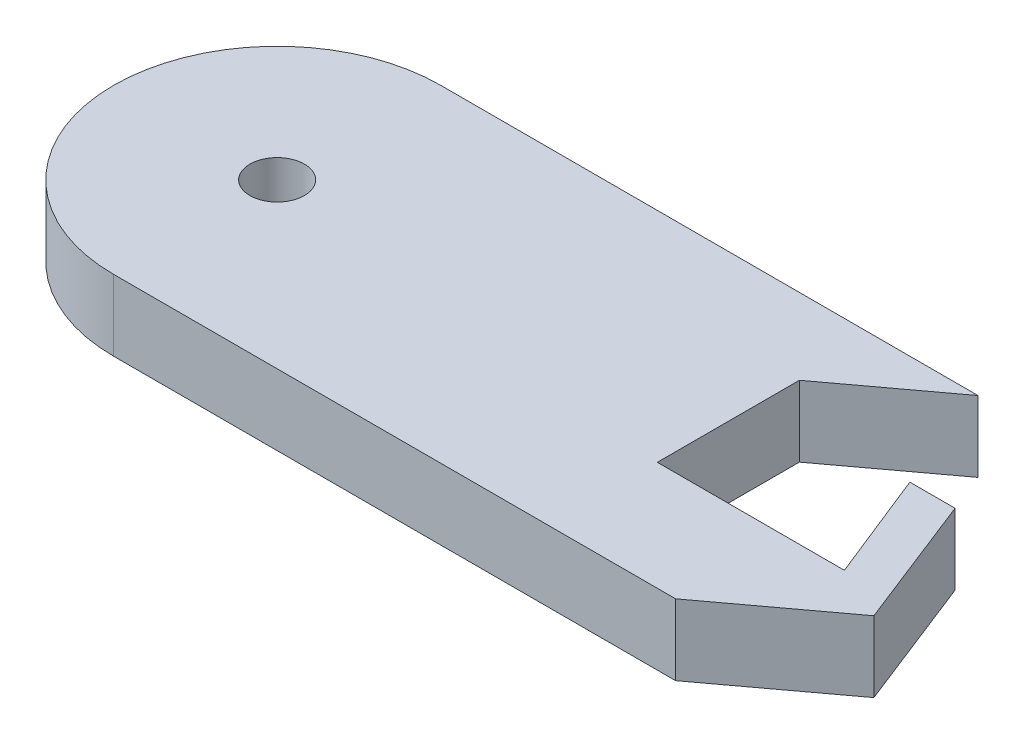
ISO-10303-21;
HEADER;
FILE_DESCRIPTION(('STEP AP214'),'2;1');
FILE_NAME('part.step','',(''),(''),'','','');
FILE_SCHEMA(('AUTOMOTIVE_DESIGN { 1 0 10303 214 1 1 1 1 }'));
ENDSEC;
DATA;
#1=APPLICATION_CONTEXT('core data for automotive mechanical design processes');
#2=APPLICATION_PROTOCOL_DEFINITION('international standard','automotive_design',2000,#1);
#3=PRODUCT_CONTEXT('',#1,'mechanical');
#4=PRODUCT('Part','Part','',(#3));
#5=PRODUCT_RELATED_PRODUCT_CATEGORY('part','',(#4));
#6=PRODUCT_DEFINITION_FORMATION('','',#4);
#7=PRODUCT_DEFINITION_CONTEXT('part definition',#1,'design');
#8=PRODUCT_DEFINITION('design','',#6,#7);
#9=PRODUCT_DEFINITION_SHAPE('','',#8);
#10=(LENGTH_UNIT() NAMED_UNIT(*) SI_UNIT(.MILLI.,.METRE.));
#11=(NAMED_UNIT(*) PLANE_ANGLE_UNIT() SI_UNIT($,.RADIAN.));
#12=(NAMED_UNIT(*) SI_UNIT($,.STERADIAN.) SOLID_ANGLE_UNIT());
#13=UNCERTAINTY_MEASURE_WITH_UNIT(LENGTH_MEASURE(1.E-05),#10,'distance_accuracy_value','');
#14=(GEOMETRIC_REPRESENTATION_CONTEXT(3) GLOBAL_UNCERTAINTY_ASSIGNED_CONTEXT((#13)) GLOBAL_UNIT_ASSIGNED_CONTEXT((#10,
#11,#12)) REPRESENTATION_CONTEXT('',''));
#15=CARTESIAN_POINT('',(0.,0.,0.));
#16=DIRECTION('',(0.,0.,1.));
#17=DIRECTION('',(1.,0.,0.));
#18=AXIS2_PLACEMENT_3D('',#15,#16,#17);
#19=CARTESIAN_POINT('',(0.,6.5,0.));
#20=DIRECTION('',(0.,0.,-1.));
#21=DIRECTION('',(-1.,0.,0.));
#22=AXIS2_PLACEMENT_3D('',#19,#20,#21);
#23=PLANE('',#22);
#24=DIRECTION('',(1.,0.,0.));
#25=VECTOR('',#24,1.);
#26=CARTESIAN_POINT('',(0.,0.,0.));
#27=LINE('',#26,#25);
#28=CARTESIAN_POINT('',(15.,0.,0.));
#29=VERTEX_POINT('',#28);
#30=CARTESIAN_POINT('',(66.5254035020398,0.,0.));
#31=VERTEX_POINT('',#30);
#32=EDGE_CURVE('E127',#29,#31,#27,.T.);
#33=ORIENTED_EDGE('',*,*,#32,.T.);
#34=DIRECTION('',(0.,1.,0.));
#35=VECTOR('',#34,1.);
#36=CARTESIAN_POINT('',(66.5254035020398,0.,0.));
#37=LINE('',#36,#35);
#38=CARTESIAN_POINT('',(66.5254035020398,6.5,0.));
#39=VERTEX_POINT('',#38);
#40=EDGE_CURVE('E113',#31,#39,#37,.T.);
#41=ORIENTED_EDGE('',*,*,#40,.T.);
#42=DIRECTION('',(1.,0.,0.));
#43=VECTOR('',#42,1.);
#44=CARTESIAN_POINT('',(0.,6.5,0.));
#45=LINE('',#44,#43);
#46=CARTESIAN_POINT('',(15.,6.5,0.));
#47=VERTEX_POINT('',#46);
#48=EDGE_CURVE('E136',#47,#39,#45,.T.);
#49=ORIENTED_EDGE('',*,*,#48,.F.);
#50=DIRECTION('',(0.,-1.,0.));
#51=VECTOR('',#50,1.);
#52=CARTESIAN_POINT('',(15.,6.5,0.));
#53=LINE('',#52,#51);
#54=EDGE_CURVE('E132',#47,#29,#53,.T.);
#55=ORIENTED_EDGE('',*,*,#54,.T.);
#56=EDGE_LOOP('',(#33,#41,#49,#55));
#57=FACE_BOUND('',#56,.T.);
#58=ADVANCED_FACE('F33',(#57),#23,.F.);
#59=CARTESIAN_POINT('',(0.,6.5,-30.));
#60=DIRECTION('',(0.,0.,1.));
#61=DIRECTION('',(1.,0.,0.));
#62=AXIS2_PLACEMENT_3D('',#59,#60,#61);
#63=PLANE('',#62);
#64=DIRECTION('',(-1.,0.,0.));
#65=VECTOR('',#64,1.);
#66=CARTESIAN_POINT('',(0.,6.5,-30.));
#67=LINE('',#66,#65);
#68=CARTESIAN_POINT('',(64.2482131812013,6.5,-30.));
#69=VERTEX_POINT('',#68);
#70=CARTESIAN_POINT('',(15.,6.5,-30.));
#71=VERTEX_POINT('',#70);
#72=EDGE_CURVE('E141',#69,#71,#67,.T.);
#73=ORIENTED_EDGE('',*,*,#72,.F.);
#74=DIRECTION('',(0.,1.,0.));
#75=VECTOR('',#74,1.);
#76=CARTESIAN_POINT('',(64.2482131812013,0.,-30.));
#77=LINE('',#76,#75);
#78=CARTESIAN_POINT('',(64.2482131812013,0.,-30.));
#79=VERTEX_POINT('',#78);
#80=EDGE_CURVE('E179',#79,#69,#77,.T.);
#81=ORIENTED_EDGE('',*,*,#80,.F.);
#82=DIRECTION('',(-1.,0.,0.));
#83=VECTOR('',#82,1.);
#84=CARTESIAN_POINT('',(0.,0.,-30.));
#85=LINE('',#84,#83);
#86=CARTESIAN_POINT('',(15.,0.,-30.));
#87=VERTEX_POINT('',#86);
#88=EDGE_CURVE('E133',#79,#87,#85,.T.);
#89=ORIENTED_EDGE('',*,*,#88,.T.);
#90=DIRECTION('',(0.,-1.,0.));
#91=VECTOR('',#90,1.);
#92=CARTESIAN_POINT('',(15.,6.5,-30.));
#93=LINE('',#92,#91);
#94=EDGE_CURVE('E41',#87,#71,#93,.F.);
#95=ORIENTED_EDGE('',*,*,#94,.T.);
#96=EDGE_LOOP('',(#73,#81,#89,#95));
#97=FACE_BOUND('',#96,.T.);
#98=ADVANCED_FACE('F159',(#97),#63,.F.);
#99=CARTESIAN_POINT('',(0.,6.5,0.));
#100=DIRECTION('',(0.,-1.,0.));
#101=DIRECTION('',(0.,0.,-1.));
#102=AXIS2_PLACEMENT_3D('',#99,#100,#101);
#103=PLANE('',#102);
#104=CARTESIAN_POINT('',(15.,6.5,-15.));
#105=DIRECTION('',(0.,1.,0.));
#106=DIRECTION('',(0.,0.,1.));
#107=AXIS2_PLACEMENT_3D('',#104,#105,#106);
#108=CIRCLE('',#107,2.5);
#109=CARTESIAN_POINT('',(15.,6.5,-12.5));
#110=VERTEX_POINT('',#109);
#111=EDGE_CURVE('E139',#110,#110,#108,.T.);
#112=ORIENTED_EDGE('',*,*,#111,.F.);
#113=EDGE_LOOP('',(#112));
#114=FACE_BOUND('',#113,.T.);
#115=ORIENTED_EDGE('',*,*,#48,.T.);
#116=DIRECTION('',(-0.803020489652228,0.,0.595951418488702));
#117=VECTOR('',#116,1.);
#118=CARTESIAN_POINT('',(80.,6.5,-10.));
#119=LINE('',#118,#117);
#120=CARTESIAN_POINT('',(76.9595603796193,6.5,-7.74357649905065));
#121=VERTEX_POINT('',#120);
#122=EDGE_CURVE('E116',#121,#39,#119,.T.);
#123=ORIENTED_EDGE('',*,*,#122,.F.);
#124=DIRECTION('',(0.36547745050438,0.,0.930820193792989));
#125=VECTOR('',#124,1.);
#126=CARTESIAN_POINT('',(80.,6.5,0.));
#127=LINE('',#126,#125);
#128=CARTESIAN_POINT('',(72.1471954961549,6.5,-20.));
#129=VERTEX_POINT('',#128);
#130=EDGE_CURVE('E121',#129,#121,#127,.T.);
#131=ORIENTED_EDGE('',*,*,#130,.F.);
#132=DIRECTION('',(1.,0.,0.));
#133=VECTOR('',#132,1.);
#134=CARTESIAN_POINT('',(68.,6.5,-20.));
#135=LINE('',#134,#133);
#136=CARTESIAN_POINT('',(68.,6.5,-20.));
#137=VERTEX_POINT('',#136);
#138=EDGE_CURVE('E200',#137,#129,#135,.T.);
#139=ORIENTED_EDGE('',*,*,#138,.F.);
#140=DIRECTION('',(-0.371390676354104,0.,-0.928476690885259));
#141=VECTOR('',#140,1.);
#142=CARTESIAN_POINT('',(68.,6.5,-20.));
#143=LINE('',#142,#141);
#144=CARTESIAN_POINT('',(72.,6.5,-10.));
#145=VERTEX_POINT('',#144);
#146=EDGE_CURVE('E189',#145,#137,#143,.T.);
#147=ORIENTED_EDGE('',*,*,#146,.F.);
#148=DIRECTION('',(1.,0.,0.));
#149=VECTOR('',#148,1.);
#150=CARTESIAN_POINT('',(72.,6.5,-10.));
#151=LINE('',#150,#149);
#152=CARTESIAN_POINT('',(54.8504076556922,6.5,-10.));
#153=VERTEX_POINT('',#152);
#154=EDGE_CURVE('E193',#153,#145,#151,.T.);
#155=ORIENTED_EDGE('',*,*,#154,.F.);
#156=DIRECTION('',(0.,0.,1.));
#157=VECTOR('',#156,1.);
#158=CARTESIAN_POINT('',(54.8504076556922,6.5,-10.));
#159=LINE('',#158,#157);
#160=CARTESIAN_POINT('',(54.8504076556922,6.5,-23.0255384441889));
#161=VERTEX_POINT('',#160);
#162=EDGE_CURVE('E196',#161,#153,#159,.T.);
#163=ORIENTED_EDGE('',*,*,#162,.F.);
#164=DIRECTION('',(-0.803020489652228,0.,0.595951418488701));
#165=VECTOR('',#164,1.);
#166=CARTESIAN_POINT('',(54.8504076556922,6.5,-23.0255384441889));
#167=LINE('',#166,#165);
#168=EDGE_CURVE('E171',#69,#161,#167,.T.);
#169=ORIENTED_EDGE('',*,*,#168,.F.);
#170=ORIENTED_EDGE('',*,*,#72,.T.);
#171=CARTESIAN_POINT('',(15.,6.5,-15.));
#172=DIRECTION('',(0.,-1.,0.));
#173=DIRECTION('',(0.,0.,-1.));
#174=AXIS2_PLACEMENT_3D('',#171,#172,#173);
#175=CIRCLE('',#174,15.);
#176=CARTESIAN_POINT('',(0.,6.5,-15.));
#177=VERTEX_POINT('',#176);
#178=EDGE_CURVE('E150',#71,#177,#175,.F.);
#179=ORIENTED_EDGE('',*,*,#178,.T.);
#180=CARTESIAN_POINT('',(15.,6.5,-15.));
#181=DIRECTION('',(0.,-1.,0.));
#182=DIRECTION('',(0.,0.,-1.));
#183=AXIS2_PLACEMENT_3D('',#180,#181,#182);
#184=CIRCLE('',#183,15.);
#185=EDGE_CURVE('E152',#177,#47,#184,.F.);
#186=ORIENTED_EDGE('',*,*,#185,.T.);
#187=EDGE_LOOP('',(#115,#123,#131,#139,#147,#155,#163,#169,#170,#179,#186));
#188=FACE_BOUND('',#187,.T.);
#189=ADVANCED_FACE('F167',(#114,#188),#103,.F.);
#190=CARTESIAN_POINT('',(0.,0.,0.));
#191=DIRECTION('',(0.,-1.,0.));
#192=DIRECTION('',(0.,0.,-1.));
#193=AXIS2_PLACEMENT_3D('',#190,#191,#192);
#194=PLANE('',#193);
#195=DIRECTION('',(-0.803020489652228,0.,0.595951418488702));
#196=VECTOR('',#195,1.);
#197=CARTESIAN_POINT('',(80.,0.,-10.));
#198=LINE('',#197,#196);
#199=CARTESIAN_POINT('',(76.9595603796193,0.,-7.74357649905065));
#200=VERTEX_POINT('',#199);
#201=EDGE_CURVE('E48',#200,#31,#198,.T.);
#202=ORIENTED_EDGE('',*,*,#201,.T.);
#203=ORIENTED_EDGE('',*,*,#32,.F.);
#204=CARTESIAN_POINT('',(15.,0.,-15.));
#205=DIRECTION('',(0.,-1.,0.));
#206=DIRECTION('',(0.,0.,-1.));
#207=AXIS2_PLACEMENT_3D('',#204,#205,#206);
#208=CIRCLE('',#207,15.);
#209=CARTESIAN_POINT('',(0.,0.,-15.));
#210=VERTEX_POINT('',#209);
#211=EDGE_CURVE('E148',#29,#210,#208,.T.);
#212=ORIENTED_EDGE('',*,*,#211,.T.);
#213=CARTESIAN_POINT('',(15.,0.,-15.));
#214=DIRECTION('',(0.,-1.,0.));
#215=DIRECTION('',(0.,0.,-1.));
#216=AXIS2_PLACEMENT_3D('',#213,#214,#215);
#217=CIRCLE('',#216,15.);
#218=EDGE_CURVE('E145',#210,#87,#217,.T.);
#219=ORIENTED_EDGE('',*,*,#218,.T.);
#220=ORIENTED_EDGE('',*,*,#88,.F.);
#221=DIRECTION('',(-0.803020489652228,0.,0.595951418488701));
#222=VECTOR('',#221,1.);
#223=CARTESIAN_POINT('',(54.8504076556922,0.,-23.0255384441889));
#224=LINE('',#223,#222);
#225=CARTESIAN_POINT('',(54.8504076556922,0.,-23.0255384441889));
#226=VERTEX_POINT('',#225);
#227=EDGE_CURVE('E211',#79,#226,#224,.T.);
#228=ORIENTED_EDGE('',*,*,#227,.T.);
#229=DIRECTION('',(0.,0.,1.));
#230=VECTOR('',#229,1.);
#231=CARTESIAN_POINT('',(54.8504076556922,0.,-10.));
#232=LINE('',#231,#230);
#233=CARTESIAN_POINT('',(54.8504076556922,0.,-10.));
#234=VERTEX_POINT('',#233);
#235=EDGE_CURVE('E208',#226,#234,#232,.T.);
#236=ORIENTED_EDGE('',*,*,#235,.T.);
#237=DIRECTION('',(1.,0.,0.));
#238=VECTOR('',#237,1.);
#239=CARTESIAN_POINT('',(72.,0.,-10.));
#240=LINE('',#239,#238);
#241=CARTESIAN_POINT('',(72.,0.,-10.));
#242=VERTEX_POINT('',#241);
#243=EDGE_CURVE('E205',#234,#242,#240,.T.);
#244=ORIENTED_EDGE('',*,*,#243,.T.);
#245=DIRECTION('',(-0.371390676354104,0.,-0.928476690885259));
#246=VECTOR('',#245,1.);
#247=CARTESIAN_POINT('',(68.,0.,-20.));
#248=LINE('',#247,#246);
#249=CARTESIAN_POINT('',(68.,0.,-20.));
#250=VERTEX_POINT('',#249);
#251=EDGE_CURVE('E182',#242,#250,#248,.T.);
#252=ORIENTED_EDGE('',*,*,#251,.T.);
#253=DIRECTION('',(1.,0.,0.));
#254=VECTOR('',#253,1.);
#255=CARTESIAN_POINT('',(68.,0.,-20.));
#256=LINE('',#255,#254);
#257=CARTESIAN_POINT('',(72.1471954961549,0.,-20.));
#258=VERTEX_POINT('',#257);
#259=EDGE_CURVE('E192',#250,#258,#256,.T.);
#260=ORIENTED_EDGE('',*,*,#259,.T.);
#261=DIRECTION('',(0.36547745050438,0.,0.930820193792989));
#262=VECTOR('',#261,1.);
#263=CARTESIAN_POINT('',(80.,0.,0.));
#264=LINE('',#263,#262);
#265=EDGE_CURVE('E54',#258,#200,#264,.T.);
#266=ORIENTED_EDGE('',*,*,#265,.T.);
#267=EDGE_LOOP('',(#202,#203,#212,#219,#220,#228,#236,#244,#252,#260,#266));
#268=FACE_BOUND('',#267,.T.);
#269=CARTESIAN_POINT('',(15.,0.,-15.));
#270=DIRECTION('',(0.,-1.,0.));
#271=DIRECTION('',(0.,0.,-1.));
#272=AXIS2_PLACEMENT_3D('',#269,#270,#271);
#273=CIRCLE('',#272,2.5);
#274=CARTESIAN_POINT('',(15.,0.,-12.5));
#275=VERTEX_POINT('',#274);
#276=EDGE_CURVE('E173',#275,#275,#273,.F.);
#277=ORIENTED_EDGE('',*,*,#276,.T.);
#278=EDGE_LOOP('',(#277));
#279=FACE_BOUND('',#278,.T.);
#280=ADVANCED_FACE('F125',(#268,#279),#194,.T.);
#281=CARTESIAN_POINT('',(15.,6.5,-15.));
#282=DIRECTION('',(0.,-1.,0.));
#283=DIRECTION('',(0.,0.,-1.));
#284=AXIS2_PLACEMENT_3D('',#281,#282,#283);
#285=CYLINDRICAL_SURFACE('',#284,15.);
#286=DIRECTION('',(0.,-1.,0.));
#287=VECTOR('',#286,1.);
#288=CARTESIAN_POINT('',(0.,6.5,-15.));
#289=LINE('',#288,#287);
#290=EDGE_CURVE('E134',#177,#210,#289,.T.);
#291=ORIENTED_EDGE('',*,*,#290,.F.);
#292=ORIENTED_EDGE('',*,*,#178,.F.);
#293=ORIENTED_EDGE('',*,*,#94,.F.);
#294=ORIENTED_EDGE('',*,*,#218,.F.);
#295=EDGE_LOOP('',(#291,#292,#293,#294));
#296=FACE_BOUND('',#295,.T.);
#297=ADVANCED_FACE('F35',(#296),#285,.T.);
#298=CARTESIAN_POINT('',(15.,6.5,-15.));
#299=DIRECTION('',(0.,-1.,0.));
#300=DIRECTION('',(0.,0.,-1.));
#301=AXIS2_PLACEMENT_3D('',#298,#299,#300);
#302=CYLINDRICAL_SURFACE('',#301,15.);
#303=ORIENTED_EDGE('',*,*,#185,.F.);
#304=ORIENTED_EDGE('',*,*,#290,.T.);
#305=ORIENTED_EDGE('',*,*,#211,.F.);
#306=ORIENTED_EDGE('',*,*,#54,.F.);
#307=EDGE_LOOP('',(#303,#304,#305,#306));
#308=FACE_BOUND('',#307,.T.);
#309=ADVANCED_FACE('F240',(#308),#302,.T.);
#310=CARTESIAN_POINT('',(15.,-0.00100000000000013,-15.));
#311=DIRECTION('',(0.,1.,0.));
#312=DIRECTION('',(0.,0.,1.));
#313=AXIS2_PLACEMENT_3D('',#310,#311,#312);
#314=CYLINDRICAL_SURFACE('',#313,2.5);
#315=CARTESIAN_POINT('',(15.,0.,-12.5));
#316=CARTESIAN_POINT('',(15.,0.0677083333333333,-12.5));
#317=CARTESIAN_POINT('',(15.,0.135416666666667,-12.5));
#318=CARTESIAN_POINT('',(15.,0.270833333333333,-12.5));
#319=CARTESIAN_POINT('',(15.,0.338541666666667,-12.5));
#320=CARTESIAN_POINT('',(15.,0.473958333333333,-12.5));
#321=CARTESIAN_POINT('',(15.,0.541666666666667,-12.5));
#322=CARTESIAN_POINT('',(15.,0.677083333333333,-12.5));
#323=CARTESIAN_POINT('',(15.,0.744791666666667,-12.5));
#324=CARTESIAN_POINT('',(15.,0.880208333333333,-12.5));
#325=CARTESIAN_POINT('',(15.,0.947916666666666,-12.5));
#326=CARTESIAN_POINT('',(15.,1.08333333333333,-12.5));
#327=CARTESIAN_POINT('',(15.,1.15104166666667,-12.5));
#328=CARTESIAN_POINT('',(15.,1.28645833333333,-12.5));
#329=CARTESIAN_POINT('',(15.,1.35416666666667,-12.5));
#330=CARTESIAN_POINT('',(15.,1.48958333333333,-12.5));
#331=CARTESIAN_POINT('',(15.,1.55729166666667,-12.5));
#332=CARTESIAN_POINT('',(15.,1.69270833333333,-12.5));
#333=CARTESIAN_POINT('',(15.,1.76041666666667,-12.5));
#334=CARTESIAN_POINT('',(15.,1.89583333333333,-12.5));
#335=CARTESIAN_POINT('',(15.,1.96354166666667,-12.5));
#336=CARTESIAN_POINT('',(15.,2.09895833333333,-12.5));
#337=CARTESIAN_POINT('',(15.,2.16666666666667,-12.5));
#338=CARTESIAN_POINT('',(15.,2.30208333333333,-12.5));
#339=CARTESIAN_POINT('',(15.,2.36979166666667,-12.5));
#340=CARTESIAN_POINT('',(15.,2.50520833333333,-12.5));
#341=CARTESIAN_POINT('',(15.,2.57291666666667,-12.5));
#342=CARTESIAN_POINT('',(15.,2.70833333333333,-12.5));
#343=CARTESIAN_POINT('',(15.,2.77604166666667,-12.5));
#344=CARTESIAN_POINT('',(15.,2.91145833333333,-12.5));
#345=CARTESIAN_POINT('',(15.,2.97916666666667,-12.5));
#346=CARTESIAN_POINT('',(15.,3.11458333333333,-12.5));
#347=CARTESIAN_POINT('',(15.,3.18229166666667,-12.5));
#348=CARTESIAN_POINT('',(15.,3.31770833333333,-12.5));
#349=CARTESIAN_POINT('',(15.,3.38541666666667,-12.5));
#350=CARTESIAN_POINT('',(15.,3.52083333333333,-12.5));
#351=CARTESIAN_POINT('',(15.,3.58854166666667,-12.5));
#352=CARTESIAN_POINT('',(15.,3.72395833333333,-12.5));
#353=CARTESIAN_POINT('',(15.,3.79166666666667,-12.5));
#354=CARTESIAN_POINT('',(15.,3.92708333333333,-12.5));
#355=CARTESIAN_POINT('',(15.,3.99479166666667,-12.5));
#356=CARTESIAN_POINT('',(15.,4.13020833333333,-12.5));
#357=CARTESIAN_POINT('',(15.,4.19791666666667,-12.5));
#358=CARTESIAN_POINT('',(15.,4.33333333333333,-12.5));
#359=CARTESIAN_POINT('',(15.,4.40104166666667,-12.5));
#360=CARTESIAN_POINT('',(15.,4.53645833333333,-12.5));
#361=CARTESIAN_POINT('',(15.,4.60416666666667,-12.5));
#362=CARTESIAN_POINT('',(15.,4.73958333333333,-12.5));
#363=CARTESIAN_POINT('',(15.,4.80729166666667,-12.5));
#364=CARTESIAN_POINT('',(15.,4.94270833333333,-12.5));
#365=CARTESIAN_POINT('',(15.,5.01041666666667,-12.5));
#366=CARTESIAN_POINT('',(15.,5.14583333333333,-12.5));
#367=CARTESIAN_POINT('',(15.,5.21354166666667,-12.5));
#368=CARTESIAN_POINT('',(15.,5.34895833333333,-12.5));
#369=CARTESIAN_POINT('',(15.,5.41666666666667,-12.5));
#370=CARTESIAN_POINT('',(15.,5.55208333333333,-12.5));
#371=CARTESIAN_POINT('',(15.,5.61979166666667,-12.5));
#372=CARTESIAN_POINT('',(15.,5.75520833333333,-12.5));
#373=CARTESIAN_POINT('',(15.,5.82291666666667,-12.5));
#374=CARTESIAN_POINT('',(15.,5.95833333333333,-12.5));
#375=CARTESIAN_POINT('',(15.,6.02604166666667,-12.5));
#376=CARTESIAN_POINT('',(15.,6.16145833333333,-12.5));
#377=CARTESIAN_POINT('',(15.,6.22916666666667,-12.5));
#378=CARTESIAN_POINT('',(15.,6.36458333333333,-12.5));
#379=CARTESIAN_POINT('',(15.,6.43229166666667,-12.5));
#380=CARTESIAN_POINT('',(15.,6.5,-12.5));
#381=B_SPLINE_CURVE_WITH_KNOTS('',3,(#315,#316,#317,#318,#319,#320,#321,#322,#323,#324,#325,
#326,#327,#328,#329,#330,#331,#332,#333,#334,#335,#336,#337,#338,#339,#340,#341,#342,#343,#344,
#345,#346,#347,#348,#349,#350,#351,#352,#353,#354,#355,#356,#357,#358,#359,#360,#361,#362,#363,
#364,#365,#366,#367,#368,#369,#370,#371,#372,#373,#374,#375,#376,#377,#378,#379,#380),
.UNSPECIFIED.,.F.,.F.,(4,2,2,2,2,2,2,2,2,2,2,2,2,2,2,2,2,2,2,2,2,2,2,2,2,2,2,2,2,2,2,2,4),(0.,
0.203125,0.40625,0.609375,0.8125,1.015625,1.21875,1.421875,1.625,1.828125,2.03125,2.234375,
2.4375,2.640625,2.84375,3.046875,3.25,3.453125,3.65625,3.859375,4.0625,4.265625,4.46875,
4.671875,4.875,5.078125,5.28125,5.484375,5.6875,5.890625,6.09375,6.296875,6.5),.UNSPECIFIED.);
#382=EDGE_CURVE('BSEAM242',#275,#110,#381,.T.);
#383=ORIENTED_EDGE('',*,*,#276,.F.);
#384=ORIENTED_EDGE('',*,*,#111,.T.);
#385=ORIENTED_EDGE('',*,*,#382,.T.);
#386=ORIENTED_EDGE('',*,*,#382,.F.);
#387=EDGE_LOOP('',(#383,#385,#384,#386));
#388=FACE_BOUND('',#387,.T.);
#389=ADVANCED_FACE('F242',(#388),#314,.F.);
#390=CARTESIAN_POINT('',(68.,0.,-20.));
#391=DIRECTION('',(0.,0.,1.));
#392=DIRECTION('',(1.,0.,0.));
#393=AXIS2_PLACEMENT_3D('',#390,#391,#392);
#394=PLANE('',#393);
#395=ORIENTED_EDGE('',*,*,#138,.T.);
#396=DIRECTION('',(0.,1.,0.));
#397=VECTOR('',#396,1.);
#398=CARTESIAN_POINT('',(72.1471954961549,-0.00100000000000013,-20.));
#399=LINE('',#398,#397);
#400=EDGE_CURVE('E216',#258,#129,#399,.T.);
#401=ORIENTED_EDGE('',*,*,#400,.F.);
#402=ORIENTED_EDGE('',*,*,#259,.F.);
#403=DIRECTION('',(0.,1.,0.));
#404=VECTOR('',#403,1.);
#405=CARTESIAN_POINT('',(68.,0.,-20.));
#406=LINE('',#405,#404);
#407=EDGE_CURVE('E176',#250,#137,#406,.T.);
#408=ORIENTED_EDGE('',*,*,#407,.T.);
#409=EDGE_LOOP('',(#395,#401,#402,#408));
#410=FACE_BOUND('',#409,.T.);
#411=ADVANCED_FACE('F225',(#410),#394,.F.);
#412=CARTESIAN_POINT('',(68.,0.,-20.));
#413=DIRECTION('',(0.928476690885259,0.,-0.371390676354104));
#414=DIRECTION('',(-0.371390676354104,0.,-0.928476690885259));
#415=AXIS2_PLACEMENT_3D('',#412,#413,#414);
#416=PLANE('',#415);
#417=ORIENTED_EDGE('',*,*,#146,.T.);
#418=ORIENTED_EDGE('',*,*,#407,.F.);
#419=ORIENTED_EDGE('',*,*,#251,.F.);
#420=DIRECTION('',(0.,1.,0.));
#421=VECTOR('',#420,1.);
#422=CARTESIAN_POINT('',(72.,0.,-10.));
#423=LINE('',#422,#421);
#424=EDGE_CURVE('E186',#242,#145,#423,.T.);
#425=ORIENTED_EDGE('',*,*,#424,.T.);
#426=EDGE_LOOP('',(#417,#418,#419,#425));
#427=FACE_BOUND('',#426,.T.);
#428=ADVANCED_FACE('F229',(#427),#416,.F.);
#429=CARTESIAN_POINT('',(72.,0.,-10.));
#430=DIRECTION('',(0.,0.,1.));
#431=DIRECTION('',(1.,0.,0.));
#432=AXIS2_PLACEMENT_3D('',#429,#430,#431);
#433=PLANE('',#432);
#434=ORIENTED_EDGE('',*,*,#154,.T.);
#435=ORIENTED_EDGE('',*,*,#424,.F.);
#436=ORIENTED_EDGE('',*,*,#243,.F.);
#437=DIRECTION('',(0.,1.,0.));
#438=VECTOR('',#437,1.);
#439=CARTESIAN_POINT('',(54.8504076556922,0.,-10.));
#440=LINE('',#439,#438);
#441=EDGE_CURVE('E184',#234,#153,#440,.T.);
#442=ORIENTED_EDGE('',*,*,#441,.T.);
#443=EDGE_LOOP('',(#434,#435,#436,#442));
#444=FACE_BOUND('',#443,.T.);
#445=ADVANCED_FACE('F232',(#444),#433,.F.);
#446=CARTESIAN_POINT('',(54.8504076556922,0.,-10.));
#447=DIRECTION('',(-1.,0.,0.));
#448=DIRECTION('',(0.,0.,1.));
#449=AXIS2_PLACEMENT_3D('',#446,#447,#448);
#450=PLANE('',#449);
#451=ORIENTED_EDGE('',*,*,#162,.T.);
#452=ORIENTED_EDGE('',*,*,#441,.F.);
#453=ORIENTED_EDGE('',*,*,#235,.F.);
#454=DIRECTION('',(0.,1.,0.));
#455=VECTOR('',#454,1.);
#456=CARTESIAN_POINT('',(54.8504076556922,0.,-23.0255384441889));
#457=LINE('',#456,#455);
#458=EDGE_CURVE('E181',#226,#161,#457,.T.);
#459=ORIENTED_EDGE('',*,*,#458,.T.);
#460=EDGE_LOOP('',(#451,#452,#453,#459));
#461=FACE_BOUND('',#460,.T.);
#462=ADVANCED_FACE('F235',(#461),#450,.F.);
#463=CARTESIAN_POINT('',(54.8504076556922,0.,-23.0255384441889));
#464=DIRECTION('',(-0.595951418488701,0.,-0.803020489652228));
#465=DIRECTION('',(-0.803020489652228,0.,0.595951418488701));
#466=AXIS2_PLACEMENT_3D('',#463,#464,#465);
#467=PLANE('',#466);
#468=ORIENTED_EDGE('',*,*,#168,.T.);
#469=ORIENTED_EDGE('',*,*,#458,.F.);
#470=ORIENTED_EDGE('',*,*,#227,.F.);
#471=ORIENTED_EDGE('',*,*,#80,.T.);
#472=EDGE_LOOP('',(#468,#469,#470,#471));
#473=FACE_BOUND('',#472,.T.);
#474=ADVANCED_FACE('F238',(#473),#467,.F.);
#475=CARTESIAN_POINT('',(80.,-0.00100000000000013,0.));
#476=DIRECTION('',(-0.930820193792989,0.,0.36547745050438));
#477=DIRECTION('',(0.36547745050438,0.,0.930820193792989));
#478=AXIS2_PLACEMENT_3D('',#475,#476,#477);
#479=PLANE('',#478);
#480=ORIENTED_EDGE('',*,*,#130,.T.);
#481=DIRECTION('',(0.,-1.,0.));
#482=VECTOR('',#481,1.);
#483=CARTESIAN_POINT('',(76.9595603796193,-0.00100000000000013,-7.74357649905065));
#484=LINE('',#483,#482);
#485=EDGE_CURVE('E11',#121,#200,#484,.T.);
#486=ORIENTED_EDGE('',*,*,#485,.T.);
#487=ORIENTED_EDGE('',*,*,#265,.F.);
#488=ORIENTED_EDGE('',*,*,#400,.T.);
#489=EDGE_LOOP('',(#480,#486,#487,#488));
#490=FACE_BOUND('',#489,.T.);
#491=ADVANCED_FACE('F221',(#490),#479,.F.);
#492=CARTESIAN_POINT('',(80.,0.,-10.));
#493=DIRECTION('',(-0.595951418488702,0.,-0.803020489652228));
#494=DIRECTION('',(-0.803020489652228,0.,0.595951418488702));
#495=AXIS2_PLACEMENT_3D('',#492,#493,#494);
#496=PLANE('',#495);
#497=ORIENTED_EDGE('',*,*,#122,.T.);
#498=ORIENTED_EDGE('',*,*,#40,.F.);
#499=ORIENTED_EDGE('',*,*,#201,.F.);
#500=ORIENTED_EDGE('',*,*,#485,.F.);
#501=EDGE_LOOP('',(#497,#498,#499,#500));
#502=FACE_BOUND('',#501,.T.);
#503=ADVANCED_FACE('F114',(#502),#496,.F.);
#504=CLOSED_SHELL('',(#58,#98,#189,#280,#297,#309,#389,#411,#428,#445,#462,#474,#491,#503));
#505=MANIFOLD_SOLID_BREP('B2',#504);
#506=ADVANCED_BREP_SHAPE_REPRESENTATION('',(#18,#505),#14);
#507=SHAPE_DEFINITION_REPRESENTATION(#9,#506);
ENDSEC;
END-ISO-10303-21;
